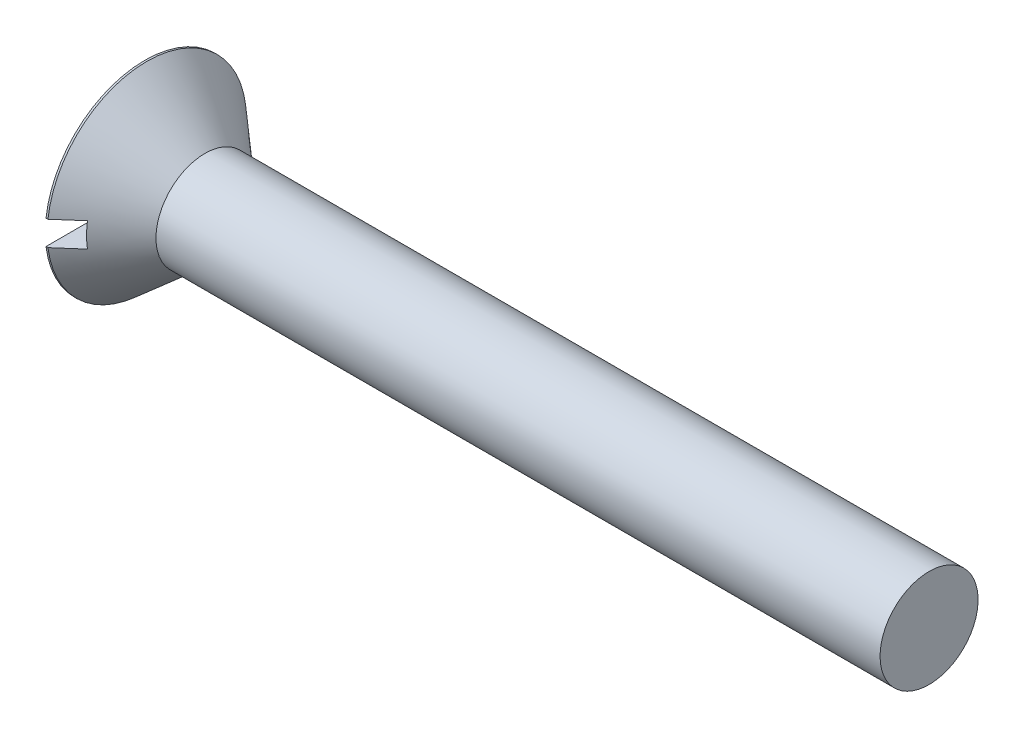
ISO-10303-21;
HEADER;
FILE_DESCRIPTION(('STEP AP214'),'2;1');
FILE_NAME('part.step','',(''),(''),'','','');
FILE_SCHEMA(('AUTOMOTIVE_DESIGN { 1 0 10303 214 1 1 1 1 }'));
ENDSEC;
DATA;
#1=APPLICATION_CONTEXT('core data for automotive mechanical design processes');
#2=APPLICATION_PROTOCOL_DEFINITION('international standard','automotive_design',2000,#1);
#3=PRODUCT_CONTEXT('',#1,'mechanical');
#4=PRODUCT('Part','Part','',(#3));
#5=PRODUCT_RELATED_PRODUCT_CATEGORY('part','',(#4));
#6=PRODUCT_DEFINITION_FORMATION('','',#4);
#7=PRODUCT_DEFINITION_CONTEXT('part definition',#1,'design');
#8=PRODUCT_DEFINITION('design','',#6,#7);
#9=PRODUCT_DEFINITION_SHAPE('','',#8);
#10=(LENGTH_UNIT() NAMED_UNIT(*) SI_UNIT(.MILLI.,.METRE.));
#11=(NAMED_UNIT(*) PLANE_ANGLE_UNIT() SI_UNIT($,.RADIAN.));
#12=(NAMED_UNIT(*) SI_UNIT($,.STERADIAN.) SOLID_ANGLE_UNIT());
#13=UNCERTAINTY_MEASURE_WITH_UNIT(LENGTH_MEASURE(1.E-05),#10,'distance_accuracy_value','');
#14=(GEOMETRIC_REPRESENTATION_CONTEXT(3) GLOBAL_UNCERTAINTY_ASSIGNED_CONTEXT((#13)) GLOBAL_UNIT_ASSIGNED_CONTEXT((#10,
#11,#12)) REPRESENTATION_CONTEXT('',''));
#15=CARTESIAN_POINT('',(0.,0.,0.));
#16=DIRECTION('',(0.,0.,1.));
#17=DIRECTION('',(1.,0.,0.));
#18=AXIS2_PLACEMENT_3D('',#15,#16,#17);
#19=CARTESIAN_POINT('',(0.,0.,0.));
#20=DIRECTION('',(-1.,0.,0.));
#21=DIRECTION('',(0.,0.,1.));
#22=AXIS2_PLACEMENT_3D('',#19,#20,#21);
#23=PLANE('',#22);
#24=DIRECTION('',(0.,0.,-1.));
#25=VECTOR('',#24,1.);
#26=CARTESIAN_POINT('',(0.,1.1938,9.6774));
#27=LINE('',#26,#25);
#28=CARTESIAN_POINT('',(0.,1.1938,9.60348438432634));
#29=VERTEX_POINT('',#28);
#30=CARTESIAN_POINT('',(0.,1.1938,-9.60348438432634));
#31=VERTEX_POINT('',#30);
#32=EDGE_CURVE('E143',#29,#31,#27,.T.);
#33=ORIENTED_EDGE('',*,*,#32,.F.);
#34=CARTESIAN_POINT('',(0.,0.,0.));
#35=DIRECTION('',(-1.,0.,0.));
#36=DIRECTION('',(0.,0.,1.));
#37=AXIS2_PLACEMENT_3D('',#34,#35,#36);
#38=CIRCLE('',#37,9.6774);
#39=EDGE_CURVE('E98',#29,#31,#38,.T.);
#40=ORIENTED_EDGE('',*,*,#39,.T.);
#41=EDGE_LOOP('',(#33,#40));
#42=FACE_BOUND('',#41,.T.);
#43=ADVANCED_FACE('F32',(#42),#23,.T.);
#44=CARTESIAN_POINT('',(-6.34999999999999,0.,0.));
#45=DIRECTION('',(-1.,0.,0.));
#46=DIRECTION('',(0.,0.,1.));
#47=AXIS2_PLACEMENT_3D('',#44,#45,#46);
#48=CYLINDRICAL_SURFACE('',#47,9.6774);
#49=DIRECTION('',(-1.,0.,0.));
#50=VECTOR('',#49,1.);
#51=CARTESIAN_POINT('',(-6.34999999999999,1.1938,-9.60348438432634));
#52=LINE('',#51,#50);
#53=CARTESIAN_POINT('',(0.188054315349483,1.1938,-9.60348438432635));
#54=VERTEX_POINT('',#53);
#55=EDGE_CURVE('E60',#31,#54,#52,.F.);
#56=ORIENTED_EDGE('',*,*,#55,.F.);
#57=ORIENTED_EDGE('',*,*,#39,.F.);
#58=DIRECTION('',(-1.,0.,0.));
#59=VECTOR('',#58,1.);
#60=CARTESIAN_POINT('',(-6.34999999999999,1.1938,9.60348438432634));
#61=LINE('',#60,#59);
#62=CARTESIAN_POINT('',(0.188054315349483,1.1938,9.60348438432635));
#63=VERTEX_POINT('',#62);
#64=EDGE_CURVE('E146',#63,#29,#61,.T.);
#65=ORIENTED_EDGE('',*,*,#64,.F.);
#66=CARTESIAN_POINT('',(0.188054315349483,0.,0.));
#67=DIRECTION('',(-1.,0.,0.));
#68=DIRECTION('',(0.,0.,1.));
#69=AXIS2_PLACEMENT_3D('',#66,#67,#68);
#70=CIRCLE('',#69,9.6774);
#71=EDGE_CURVE('E109',#63,#54,#70,.T.);
#72=ORIENTED_EDGE('',*,*,#71,.T.);
#73=EDGE_LOOP('',(#56,#57,#65,#72));
#74=FACE_BOUND('',#73,.T.);
#75=ADVANCED_FACE('F145',(#74),#48,.T.);
#76=DIRECTION('',(0.,0.,1.));
#77=VECTOR('',#76,1.);
#78=CARTESIAN_POINT('',(0.,-1.1938,-9.6774));
#79=LINE('',#78,#77);
#80=CARTESIAN_POINT('',(0.,-1.1938,-9.60348438432634));
#81=VERTEX_POINT('',#80);
#82=CARTESIAN_POINT('',(0.,-1.1938,9.60348438432634));
#83=VERTEX_POINT('',#82);
#84=EDGE_CURVE('E103',#81,#83,#79,.T.);
#85=ORIENTED_EDGE('',*,*,#84,.F.);
#86=EDGE_CURVE('E128',#81,#83,#38,.T.);
#87=ORIENTED_EDGE('',*,*,#86,.T.);
#88=EDGE_LOOP('',(#85,#87));
#89=FACE_BOUND('',#88,.T.);
#90=ADVANCED_FACE('F34',(#89),#23,.T.);
#91=DIRECTION('',(-1.,0.,0.));
#92=VECTOR('',#91,1.);
#93=CARTESIAN_POINT('',(-6.34999999999999,-1.1938,9.60348438432634));
#94=LINE('',#93,#92);
#95=CARTESIAN_POINT('',(0.188054315349483,-1.1938,9.60348438432635));
#96=VERTEX_POINT('',#95);
#97=EDGE_CURVE('E129',#83,#96,#94,.F.);
#98=ORIENTED_EDGE('',*,*,#97,.F.);
#99=ORIENTED_EDGE('',*,*,#86,.F.);
#100=DIRECTION('',(-1.,0.,0.));
#101=VECTOR('',#100,1.);
#102=CARTESIAN_POINT('',(-6.34999999999999,-1.1938,-9.60348438432634));
#103=LINE('',#102,#101);
#104=CARTESIAN_POINT('',(0.188054315349483,-1.1938,-9.60348438432635));
#105=VERTEX_POINT('',#104);
#106=EDGE_CURVE('E118',#105,#81,#103,.T.);
#107=ORIENTED_EDGE('',*,*,#106,.F.);
#108=EDGE_CURVE('E126',#105,#96,#70,.T.);
#109=ORIENTED_EDGE('',*,*,#108,.T.);
#110=EDGE_LOOP('',(#98,#99,#107,#109));
#111=FACE_BOUND('',#110,.T.);
#112=ADVANCED_FACE('F125',(#111),#48,.T.);
#113=CARTESIAN_POINT('',(0.188054315349483,0.,0.));
#114=DIRECTION('',(-1.,0.,0.));
#115=DIRECTION('',(0.,0.,1.));
#116=AXIS2_PLACEMENT_3D('',#113,#114,#115);
#117=CONICAL_SURFACE('',#116,9.6774,0.715584993317677);
#118=CARTESIAN_POINT('',(-11.4898026353366,1.1938,-19.7928369826092));
#119=CARTESIAN_POINT('',(-10.7282739013221,1.1938,-19.1296381719911));
#120=CARTESIAN_POINT('',(-9.96679664791202,1.1938,-18.4663802073044));
#121=CARTESIAN_POINT('',(-8.44400448853546,1.1938,-17.1396696071036));
#122=CARTESIAN_POINT('',(-7.68268958347168,1.1938,-16.4762169705534));
#123=CARTESIAN_POINT('',(-6.16009107003556,1.1938,-15.1488746382848));
#124=CARTESIAN_POINT('',(-5.39880752170639,1.1938,-14.4849848736861));
#125=CARTESIAN_POINT('',(-3.87658787542096,1.1938,-13.156815015664));
#126=CARTESIAN_POINT('',(-3.11565177568116,1.1938,-12.4925349242851));
#127=CARTESIAN_POINT('',(-1.61266837529184,1.1938,-11.1793728113545));
#128=CARTESIAN_POINT('',(-0.870608031036538,1.1938,-10.5305057197294));
#129=CARTESIAN_POINT('',(0.612654729346588,1.1938,-9.23176820965605));
#130=CARTESIAN_POINT('',(1.35385713234852,1.1938,-8.58189777620339));
#131=CARTESIAN_POINT('',(2.46431349757707,1.1938,-7.6057063127283));
#132=CARTESIAN_POINT('',(2.83420463694768,1.1938,-7.28011039465054));
#133=CARTESIAN_POINT('',(3.5733462958958,1.1938,-6.62818839376527));
#134=CARTESIAN_POINT('',(3.94259681230671,1.1938,-6.30186230736668));
#135=CARTESIAN_POINT('',(4.68009898382822,1.1938,-5.64810195873326));
#136=CARTESIAN_POINT('',(5.04835066622805,1.1938,-5.32066772733487));
#137=CARTESIAN_POINT('',(5.59944958950579,1.1938,-4.828088397102));
#138=CARTESIAN_POINT('',(5.78293538370408,1.1938,-4.66365796437121));
#139=CARTESIAN_POINT('',(6.14932062944482,1.1938,-4.33414540663899));
#140=CARTESIAN_POINT('',(6.33222008249685,1.1938,-4.16906328331783));
#141=CARTESIAN_POINT('',(6.61085838707249,1.1938,-3.91630624190142));
#142=CARTESIAN_POINT('',(6.7068950906178,1.1938,-3.82895981383194));
#143=CARTESIAN_POINT('',(6.89868546128946,1.1938,-3.65395652107032));
#144=CARTESIAN_POINT('',(6.99443912761007,1.1938,-3.56629965549599));
#145=CARTESIAN_POINT('',(7.28123634095181,1.1938,-3.30272759921683));
#146=CARTESIAN_POINT('',(7.47176893215877,1.1938,-3.12625362774134));
#147=CARTESIAN_POINT('',(7.75652836875402,1.1938,-2.85918720679188));
#148=CARTESIAN_POINT('',(7.85158225556605,1.1938,-2.76947695394893));
#149=CARTESIAN_POINT('',(8.04094270173715,1.1938,-2.58927165090814));
#150=CARTESIAN_POINT('',(8.13524926866174,1.1938,-2.49877660867459));
#151=CARTESIAN_POINT('',(8.32280199349844,1.1938,-2.31680042579566));
#152=CARTESIAN_POINT('',(8.41604873368795,1.1938,-2.22531988634259));
#153=CARTESIAN_POINT('',(8.6011346078612,1.1938,-2.04094854239069));
#154=CARTESIAN_POINT('',(8.6929738110529,1.1938,-1.94805780768049));
#155=CARTESIAN_POINT('',(8.87422797190535,1.1938,-1.76066399626998));
#156=CARTESIAN_POINT('',(8.96365125965577,1.1938,-1.66616899895782));
#157=CARTESIAN_POINT('',(9.13952454990479,1.1938,-1.47414431004954));
#158=CARTESIAN_POINT('',(9.22596985906224,1.1938,-1.37661025170417));
#159=CARTESIAN_POINT('',(9.35151816301608,1.1938,-1.22717825186044));
#160=CARTESIAN_POINT('',(9.39260236634853,1.1938,-1.17695004477579));
#161=CARTESIAN_POINT('',(9.47299969614775,1.1938,-1.07510106345905));
#162=CARTESIAN_POINT('',(9.5123131602323,1.1938,-1.02348055771595));
#163=CARTESIAN_POINT('',(9.58844644905848,1.1938,-0.918595747564626));
#164=CARTESIAN_POINT('',(9.62527166053205,1.1938,-0.865335382851739));
#165=CARTESIAN_POINT('',(9.69553557346323,1.1938,-0.756643066731603));
#166=CARTESIAN_POINT('',(9.72897683777324,1.1938,-0.701212803511129));
#167=CARTESIAN_POINT('',(9.78229490989066,1.1938,-0.603634652350031));
#168=CARTESIAN_POINT('',(9.80334267457935,1.1938,-0.562131586710286));
#169=CARTESIAN_POINT('',(9.84217202855095,1.1938,-0.47758953141221));
#170=CARTESIAN_POINT('',(9.85995294441654,1.1938,-0.434550227257595));
#171=CARTESIAN_POINT('',(9.89116809212026,1.1938,-0.347314527152102));
#172=CARTESIAN_POINT('',(9.90463847934805,1.1938,-0.303131307184443));
#173=CARTESIAN_POINT('',(9.92643385134319,1.1938,-0.213513453313853));
#174=CARTESIAN_POINT('',(9.93476333760671,1.1938,-0.16807995071195));
#175=CARTESIAN_POINT('',(9.94391422293017,1.1938,-0.0900477356647803));
#176=CARTESIAN_POINT('',(9.94622642713138,1.1938,-0.057620890433388));
#177=CARTESIAN_POINT('',(9.94780330336011,1.1938,0.00730866444990611));
#178=CARTESIAN_POINT('',(9.94706765854469,1.1938,0.039811381638135));
#179=CARTESIAN_POINT('',(9.94028733688771,1.1938,0.137101431386455));
#180=CARTESIAN_POINT('',(9.92966101559382,1.1938,0.20160008074918));
#181=CARTESIAN_POINT('',(9.89262661505728,1.1938,0.35049459972825));
#182=CARTESIAN_POINT('',(9.86193906369473,1.1938,0.433774450610289));
#183=CARTESIAN_POINT('',(9.80699388473532,1.1938,0.554532522865811));
#184=CARTESIAN_POINT('',(9.78712669328242,1.1938,0.594194052190609));
#185=CARTESIAN_POINT('',(9.74504611916625,1.1938,0.672252055325658));
#186=CARTESIAN_POINT('',(9.72283341846574,1.1938,0.710648892611942));
#187=CARTESIAN_POINT('',(9.65802013239421,1.1938,0.816731429600172));
#188=CARTESIAN_POINT('',(9.61337970085071,1.1938,0.883159086062938));
#189=CARTESIAN_POINT('',(9.52026331206001,1.1938,1.01329132600744));
#190=CARTESIAN_POINT('',(9.47178430864526,1.1938,1.07699368376862));
#191=CARTESIAN_POINT('',(9.37210823949184,1.1938,1.20247328026239));
#192=CARTESIAN_POINT('',(9.32090484748038,1.1938,1.2642454579166));
#193=CARTESIAN_POINT('',(9.21665334057523,1.1938,1.38621561131625));
#194=CARTESIAN_POINT('',(9.16360498874108,1.1938,1.44641338311511));
#195=CARTESIAN_POINT('',(9.0558712202194,1.1938,1.56591847516017));
#196=CARTESIAN_POINT('',(9.00117844412958,1.1938,1.62521913531284));
#197=CARTESIAN_POINT('',(8.89076932576251,1.1938,1.74286468104579));
#198=CARTESIAN_POINT('',(8.83505291155422,1.1938,1.80120949890987));
#199=CARTESIAN_POINT('',(8.72293087735949,1.1938,1.91703874022853));
#200=CARTESIAN_POINT('',(8.66652659646751,1.1938,1.97452446257211));
#201=CARTESIAN_POINT('',(8.55310321239535,1.1938,2.08888148786909));
#202=CARTESIAN_POINT('',(8.49608412845418,1.1938,2.14575280993806));
#203=CARTESIAN_POINT('',(8.32594080040157,1.1938,2.31399298383076));
#204=CARTESIAN_POINT('',(8.21210974043435,1.1938,2.4246466836363));
#205=CARTESIAN_POINT('',(7.98316902601451,1.1938,2.64462506391629));
#206=CARTESIAN_POINT('',(7.86805933025104,1.1938,2.75394970121025));
#207=CARTESIAN_POINT('',(7.63692082251556,1.1938,2.97164536682997));
#208=CARTESIAN_POINT('',(7.52089191915196,1.1938,3.08001629801449));
#209=CARTESIAN_POINT('',(7.2881654688085,1.1938,3.29603831860986));
#210=CARTESIAN_POINT('',(7.17146791737414,1.1938,3.40368940321475));
#211=CARTESIAN_POINT('',(6.8204206104814,1.1938,3.72601676561741));
#212=CARTESIAN_POINT('',(6.58532082273434,1.1938,3.93987573533653));
#213=CARTESIAN_POINT('',(6.11392315985063,1.1938,4.36623728025011));
#214=CARTESIAN_POINT('',(5.87762535629344,1.1938,4.57873993480768));
#215=CARTESIAN_POINT('',(5.40574548920108,1.1938,5.00148246261154));
#216=CARTESIAN_POINT('',(5.17016858782836,1.1938,5.21172810071984));
#217=CARTESIAN_POINT('',(4.69845742605191,1.1938,5.63159996322499));
#218=CARTESIAN_POINT('',(4.46232315719595,1.1938,5.8412261781186));
#219=CARTESIAN_POINT('',(3.75350149685631,1.1938,6.46928311178162));
#220=CARTESIAN_POINT('',(3.28022270774331,1.1938,6.88704616821166));
#221=CARTESIAN_POINT('',(2.21621828719052,1.1938,7.82423394194819));
#222=CARTESIAN_POINT('',(1.62524790719567,1.1938,8.34338046616924));
#223=CARTESIAN_POINT('',(0.442525830117864,1.1938,9.38078521090227));
#224=CARTESIAN_POINT('',(-0.149225868826985,1.1938,9.89904342929061));
#225=CARTESIAN_POINT('',(-1.33330631305607,1.1938,10.9350846526926));
#226=CARTESIAN_POINT('',(-1.92563513333196,1.1938,11.4528675719739));
#227=CARTESIAN_POINT('',(-3.11061605933093,1.1938,12.4880633822659));
#228=CARTESIAN_POINT('',(-3.70326816507868,1.1938,13.0054762732481));
#229=CARTESIAN_POINT('',(-5.49445193685419,1.1938,14.5685909035739));
#230=CARTESIAN_POINT('',(-6.69332378922161,1.1938,15.6139027891056));
#231=CARTESIAN_POINT('',(-8.49189186130723,1.1938,17.1813761403767));
#232=CARTESIAN_POINT('',(-9.09140946247876,1.1938,17.7037426397592));
#233=CARTESIAN_POINT('',(-10.2905401878066,1.1938,18.7483656046404));
#234=CARTESIAN_POINT('',(-10.8901533119325,1.1938,19.2706220701738));
#235=CARTESIAN_POINT('',(-11.4898026353366,1.1938,19.7928369826092));
#236=B_SPLINE_CURVE_WITH_KNOTS('',3,(#118,#119,#120,#121,#122,#123,#124,#125,#126,#127,#128,
#129,#130,#131,#132,#133,#134,#135,#136,#137,#138,#139,#140,#141,#142,#143,#144,#145,#146,#147,
#148,#149,#150,#151,#152,#153,#154,#155,#156,#157,#158,#159,#160,#161,#162,#163,#164,#165,#166,
#167,#168,#169,#170,#171,#172,#173,#174,#175,#176,#177,#178,#179,#180,#181,#182,#183,#184,#185,
#186,#187,#188,#189,#190,#191,#192,#193,#194,#195,#196,#197,#198,#199,#200,#201,#202,#203,#204,
#205,#206,#207,#208,#209,#210,#211,#212,#213,#214,#215,#216,#217,#218,#219,#220,#221,#222,#223,
#224,#225,#226,#227,#228,#229,#230,#231,#232,#233,#234,#235),.UNSPECIFIED.,.F.,.F.,(4,2,2,2,2,2,
2,2,2,2,2,2,2,2,2,2,2,2,2,2,2,2,2,2,2,2,2,2,2,2,2,2,2,2,2,2,2,2,2,2,2,2,2,2,2,2,2,2,2,2,2,2,2,2,
2,2,2,2,4),(0.,3.0294930783553,6.05900258307004,9.08930288302097,12.1195874489531,
15.0768051830438,18.0340675777782,19.512406974151,20.9907536572677,22.4690595351237,
23.2082064359523,23.9473514322697,24.3368016586253,24.7262529926026,25.5053464943481,
25.8974512032567,26.2895519376056,26.6814256802503,27.0732800924151,27.4635432269829,
27.8543956331783,28.0490394420361,28.2436459806837,28.4378167485541,28.6318393417547,
28.7713378867965,28.9108651554193,29.049189416706,29.1873923854761,29.2847831846665,
29.3821841084928,29.5771956093359,29.8418190426298,29.9748586210594,30.1078596238524,
30.3477358586735,30.5878043970473,30.8284570413328,31.0691407065908,31.3111390700322,
31.5531545042363,31.7947567435244,32.0363514441758,32.5125848503851,32.9888336880144,
33.4651304859523,33.9414304606563,34.894870958739,35.8482551463319,36.7955112649444,
37.7427818417582,39.6366290834052,41.9964650492509,44.3563066488178,46.7165126240292,
49.0767187793924,53.8484828133056,56.2339792041329,58.619474838325),.UNSPECIFIED.);
#237=CARTESIAN_POINT('',(2.2352,1.1938,-7.80709754166015));
#238=VERTEX_POINT('',#237);
#239=EDGE_CURVE('E11',#54,#238,#236,.T.);
#240=ORIENTED_EDGE('',*,*,#239,.F.);
#241=ORIENTED_EDGE('',*,*,#71,.F.);
#242=CARTESIAN_POINT('',(2.2352,1.1938,7.80709754166015));
#243=VERTEX_POINT('',#242);
#244=EDGE_CURVE('E36',#243,#63,#236,.T.);
#245=ORIENTED_EDGE('',*,*,#244,.F.);
#246=CARTESIAN_POINT('',(2.2352,0.,0.));
#247=DIRECTION('',(-1.,0.,0.));
#248=DIRECTION('',(0.,0.,1.));
#249=AXIS2_PLACEMENT_3D('',#246,#247,#248);
#250=CIRCLE('',#249,7.89784340595558);
#251=CARTESIAN_POINT('',(2.2352,-1.1938,7.80709754166015));
#252=VERTEX_POINT('',#251);
#253=EDGE_CURVE('E89',#243,#252,#250,.F.);
#254=ORIENTED_EDGE('',*,*,#253,.T.);
#255=CARTESIAN_POINT('',(-11.4898026353366,-1.1938,19.7928369826092));
#256=CARTESIAN_POINT('',(-10.7282739013221,-1.1938,19.1296381719911));
#257=CARTESIAN_POINT('',(-9.96679664791202,-1.1938,18.4663802073045));
#258=CARTESIAN_POINT('',(-8.44400448853547,-1.1938,17.1396696071036));
#259=CARTESIAN_POINT('',(-7.68268958347169,-1.1938,16.4762169705534));
#260=CARTESIAN_POINT('',(-6.16009107003557,-1.1938,15.1488746382848));
#261=CARTESIAN_POINT('',(-5.39880752170641,-1.1938,14.4849848736861));
#262=CARTESIAN_POINT('',(-3.87658787542097,-1.1938,13.156815015664));
#263=CARTESIAN_POINT('',(-3.11565177568118,-1.1938,12.4925349242851));
#264=CARTESIAN_POINT('',(-1.61266837529185,-1.1938,11.1793728113545));
#265=CARTESIAN_POINT('',(-0.870608031036553,-1.1938,10.5305057197294));
#266=CARTESIAN_POINT('',(0.612654729346576,-1.1938,9.23176820965606));
#267=CARTESIAN_POINT('',(1.35385713234851,-1.1938,8.5818977762034));
#268=CARTESIAN_POINT('',(2.46431349757706,-1.1938,7.60570631272831));
#269=CARTESIAN_POINT('',(2.83420463694767,-1.1938,7.28011039465055));
#270=CARTESIAN_POINT('',(3.5733462958958,-1.1938,6.62818839376528));
#271=CARTESIAN_POINT('',(3.9425968123067,-1.1938,6.30186230736669));
#272=CARTESIAN_POINT('',(4.68009898382822,-1.1938,5.64810195873326));
#273=CARTESIAN_POINT('',(5.04835066622804,-1.1938,5.32066772733487));
#274=CARTESIAN_POINT('',(5.59944958950579,-1.1938,4.828088397102));
#275=CARTESIAN_POINT('',(5.78293538370408,-1.1938,4.66365796437121));
#276=CARTESIAN_POINT('',(6.14932062944482,-1.1938,4.33414540663899));
#277=CARTESIAN_POINT('',(6.33222008249685,-1.1938,4.16906328331784));
#278=CARTESIAN_POINT('',(6.61085838707249,-1.1938,3.91630624190142));
#279=CARTESIAN_POINT('',(6.7068950906178,-1.1938,3.82895981383194));
#280=CARTESIAN_POINT('',(6.89868546128946,-1.1938,3.65395652107033));
#281=CARTESIAN_POINT('',(6.99443912761006,-1.1938,3.56629965549599));
#282=CARTESIAN_POINT('',(7.28123634095181,-1.1938,3.30272759921684));
#283=CARTESIAN_POINT('',(7.47176893215877,-1.1938,3.12625362774134));
#284=CARTESIAN_POINT('',(7.75652836875402,-1.1938,2.85918720679188));
#285=CARTESIAN_POINT('',(7.85158225556605,-1.1938,2.76947695394893));
#286=CARTESIAN_POINT('',(8.04094270173715,-1.1938,2.58927165090814));
#287=CARTESIAN_POINT('',(8.13524926866174,-1.1938,2.49877660867459));
#288=CARTESIAN_POINT('',(8.32280199349844,-1.1938,2.31680042579566));
#289=CARTESIAN_POINT('',(8.41604873368795,-1.1938,2.22531988634259));
#290=CARTESIAN_POINT('',(8.6011346078612,-1.1938,2.04094854239069));
#291=CARTESIAN_POINT('',(8.6929738110529,-1.1938,1.94805780768049));
#292=CARTESIAN_POINT('',(8.87422797190534,-1.1938,1.76066399626998));
#293=CARTESIAN_POINT('',(8.96365125965577,-1.1938,1.66616899895783));
#294=CARTESIAN_POINT('',(9.13952454990478,-1.1938,1.47414431004954));
#295=CARTESIAN_POINT('',(9.22596985906224,-1.1938,1.37661025170417));
#296=CARTESIAN_POINT('',(9.35151816301608,-1.1938,1.22717825186044));
#297=CARTESIAN_POINT('',(9.39260236634853,-1.1938,1.17695004477579));
#298=CARTESIAN_POINT('',(9.47299969614775,-1.1938,1.07510106345905));
#299=CARTESIAN_POINT('',(9.5123131602323,-1.1938,1.02348055771595));
#300=CARTESIAN_POINT('',(9.58844644905848,-1.1938,0.918595747564625));
#301=CARTESIAN_POINT('',(9.62527166053205,-1.1938,0.865335382851739));
#302=CARTESIAN_POINT('',(9.69553557346323,-1.1938,0.756643066731603));
#303=CARTESIAN_POINT('',(9.72897683777324,-1.1938,0.701212803511128));
#304=CARTESIAN_POINT('',(9.78229490989066,-1.1938,0.603634652350028));
#305=CARTESIAN_POINT('',(9.80334267457935,-1.1938,0.562131586710281));
#306=CARTESIAN_POINT('',(9.84217202855096,-1.1938,0.477589531412205));
#307=CARTESIAN_POINT('',(9.85995294441654,-1.1938,0.434550227257591));
#308=CARTESIAN_POINT('',(9.89116809212026,-1.1938,0.347314527152098));
#309=CARTESIAN_POINT('',(9.90463847934805,-1.1938,0.303131307184439));
#310=CARTESIAN_POINT('',(9.92643385134319,-1.1938,0.21351345331385));
#311=CARTESIAN_POINT('',(9.93476333760671,-1.1938,0.168079950711948));
#312=CARTESIAN_POINT('',(9.94391422293017,-1.1938,0.0900477356647783));
#313=CARTESIAN_POINT('',(9.94622642713138,-1.1938,0.0576208904333856));
#314=CARTESIAN_POINT('',(9.94780330336011,-1.1938,-0.0073086644499082));
#315=CARTESIAN_POINT('',(9.94706765854469,-1.1938,-0.0398113816381363));
#316=CARTESIAN_POINT('',(9.94028733688771,-1.1938,-0.137101431386456));
#317=CARTESIAN_POINT('',(9.92966101559382,-1.1938,-0.201600080749182));
#318=CARTESIAN_POINT('',(9.89262661505728,-1.1938,-0.350494599728253));
#319=CARTESIAN_POINT('',(9.86193906369472,-1.1938,-0.433774450610293));
#320=CARTESIAN_POINT('',(9.80699388473531,-1.1938,-0.554532522865815));
#321=CARTESIAN_POINT('',(9.78712669328241,-1.1938,-0.594194052190612));
#322=CARTESIAN_POINT('',(9.74504611916624,-1.1938,-0.672252055325662));
#323=CARTESIAN_POINT('',(9.72283341846573,-1.1938,-0.710648892611947));
#324=CARTESIAN_POINT('',(9.65802013239421,-1.1938,-0.816731429600179));
#325=CARTESIAN_POINT('',(9.61337970085071,-1.1938,-0.883159086062946));
#326=CARTESIAN_POINT('',(9.52026331206,-1.1938,-1.01329132600745));
#327=CARTESIAN_POINT('',(9.47178430864525,-1.1938,-1.07699368376863));
#328=CARTESIAN_POINT('',(9.37210823949182,-1.1938,-1.2024732802624));
#329=CARTESIAN_POINT('',(9.32090484748037,-1.1938,-1.26424545791661));
#330=CARTESIAN_POINT('',(9.21665334057522,-1.1938,-1.38621561131626));
#331=CARTESIAN_POINT('',(9.16360498874107,-1.1938,-1.44641338311512));
#332=CARTESIAN_POINT('',(9.05587122021939,-1.1938,-1.56591847516019));
#333=CARTESIAN_POINT('',(9.00117844412956,-1.1938,-1.62521913531285));
#334=CARTESIAN_POINT('',(8.8907693257625,-1.1938,-1.7428646810458));
#335=CARTESIAN_POINT('',(8.83505291155421,-1.1938,-1.80120949890989));
#336=CARTESIAN_POINT('',(8.72293087735948,-1.1938,-1.91703874022855));
#337=CARTESIAN_POINT('',(8.6665265964675,-1.1938,-1.97452446257212));
#338=CARTESIAN_POINT('',(8.55310321239533,-1.1938,-2.08888148786911));
#339=CARTESIAN_POINT('',(8.49608412845417,-1.1938,-2.14575280993808));
#340=CARTESIAN_POINT('',(8.32594080040155,-1.1938,-2.31399298383077));
#341=CARTESIAN_POINT('',(8.21210974043433,-1.1938,-2.42464668363632));
#342=CARTESIAN_POINT('',(7.98316902601449,-1.1938,-2.64462506391631));
#343=CARTESIAN_POINT('',(7.86805933025102,-1.1938,-2.75394970121027));
#344=CARTESIAN_POINT('',(7.63692082251553,-1.1938,-2.97164536682999));
#345=CARTESIAN_POINT('',(7.52089191915194,-1.1938,-3.08001629801452));
#346=CARTESIAN_POINT('',(7.28816546880847,-1.1938,-3.29603831860989));
#347=CARTESIAN_POINT('',(7.17146791737411,-1.1938,-3.40368940321477));
#348=CARTESIAN_POINT('',(6.82042061048136,-1.1938,-3.72601676561745));
#349=CARTESIAN_POINT('',(6.5853208227343,-1.1938,-3.93987573533656));
#350=CARTESIAN_POINT('',(6.11392315985058,-1.1938,-4.36623728025015));
#351=CARTESIAN_POINT('',(5.87762535629339,-1.1938,-4.57873993480773));
#352=CARTESIAN_POINT('',(5.40574548920103,-1.1938,-5.00148246261159));
#353=CARTESIAN_POINT('',(5.17016858782831,-1.1938,-5.21172810071988));
#354=CARTESIAN_POINT('',(4.69845742605185,-1.1938,-5.63159996322504));
#355=CARTESIAN_POINT('',(4.46232315719589,-1.1938,-5.84122617811866));
#356=CARTESIAN_POINT('',(3.75350149685624,-1.1938,-6.46928311178168));
#357=CARTESIAN_POINT('',(3.28022270774324,-1.1938,-6.88704616821173));
#358=CARTESIAN_POINT('',(2.21621828719044,-1.1938,-7.82423394194826));
#359=CARTESIAN_POINT('',(1.62524790719559,-1.1938,-8.34338046616931));
#360=CARTESIAN_POINT('',(0.442525830117799,-1.1938,-9.38078521090233));
#361=CARTESIAN_POINT('',(-0.149225868827044,-1.1938,-9.89904342929067));
#362=CARTESIAN_POINT('',(-1.33330631305612,-1.1938,-10.9350846526926));
#363=CARTESIAN_POINT('',(-1.92563513333201,-1.1938,-11.452867571974));
#364=CARTESIAN_POINT('',(-3.11061605933097,-1.1938,-12.4880633822659));
#365=CARTESIAN_POINT('',(-3.70326816507871,-1.1938,-13.0054762732482));
#366=CARTESIAN_POINT('',(-5.49445193685421,-1.1938,-14.5685909035739));
#367=CARTESIAN_POINT('',(-6.69332378922163,-1.1938,-15.6139027891056));
#368=CARTESIAN_POINT('',(-8.49189186130724,-1.1938,-17.1813761403767));
#369=CARTESIAN_POINT('',(-9.09140946247877,-1.1938,-17.7037426397592));
#370=CARTESIAN_POINT('',(-10.2905401878066,-1.1938,-18.7483656046404));
#371=CARTESIAN_POINT('',(-10.8901533119325,-1.1938,-19.2706220701738));
#372=CARTESIAN_POINT('',(-11.4898026353366,-1.1938,-19.7928369826092));
#373=B_SPLINE_CURVE_WITH_KNOTS('',3,(#255,#256,#257,#258,#259,#260,#261,#262,#263,#264,#265,
#266,#267,#268,#269,#270,#271,#272,#273,#274,#275,#276,#277,#278,#279,#280,#281,#282,#283,#284,
#285,#286,#287,#288,#289,#290,#291,#292,#293,#294,#295,#296,#297,#298,#299,#300,#301,#302,#303,
#304,#305,#306,#307,#308,#309,#310,#311,#312,#313,#314,#315,#316,#317,#318,#319,#320,#321,#322,
#323,#324,#325,#326,#327,#328,#329,#330,#331,#332,#333,#334,#335,#336,#337,#338,#339,#340,#341,
#342,#343,#344,#345,#346,#347,#348,#349,#350,#351,#352,#353,#354,#355,#356,#357,#358,#359,#360,
#361,#362,#363,#364,#365,#366,#367,#368,#369,#370,#371,#372),.UNSPECIFIED.,.F.,.F.,(4,2,2,2,2,2,
2,2,2,2,2,2,2,2,2,2,2,2,2,2,2,2,2,2,2,2,2,2,2,2,2,2,2,2,2,2,2,2,2,2,2,2,2,2,2,2,2,2,2,2,2,2,2,2,
2,2,2,2,4),(0.,3.02949307835529,6.05900258307003,9.08930288302095,12.1195874489531,
15.0768051830438,18.0340675777782,19.512406974151,20.9907536572677,22.4690595351237,
23.2082064359523,23.9473514322697,24.3368016586253,24.7262529926026,25.5053464943481,
25.8974512032567,26.2895519376056,26.6814256802503,27.0732800924152,27.4635432269829,
27.8543956331783,28.0490394420361,28.2436459806837,28.4378167485541,28.6318393417547,
28.7713378867965,28.9108651554193,29.049189416706,29.1873923854761,29.2847831846665,
29.3821841084928,29.5771956093359,29.8418190426298,29.9748586210594,30.1078596238524,
30.3477358586735,30.5878043970473,30.8284570413328,31.0691407065908,31.3111390700322,
31.5531545042363,31.7947567435244,32.0363514441758,32.5125848503851,32.9888336880144,
33.4651304859523,33.9414304606563,34.8948709587391,35.848255146332,36.7955112649445,
37.7427818417583,39.6366290834053,41.996465049251,44.3563066488179,46.7165126240293,
49.0767187793924,53.8484828133056,56.2339792041329,58.619474838325),.UNSPECIFIED.);
#374=EDGE_CURVE('E97',#96,#252,#373,.T.);
#375=ORIENTED_EDGE('',*,*,#374,.F.);
#376=ORIENTED_EDGE('',*,*,#108,.F.);
#377=CARTESIAN_POINT('',(2.2352,-1.1938,-7.80709754166015));
#378=VERTEX_POINT('',#377);
#379=EDGE_CURVE('E46',#378,#105,#373,.T.);
#380=ORIENTED_EDGE('',*,*,#379,.F.);
#381=EDGE_CURVE('E100',#378,#238,#250,.F.);
#382=ORIENTED_EDGE('',*,*,#381,.T.);
#383=EDGE_LOOP('',(#240,#241,#245,#254,#375,#376,#380,#382));
#384=FACE_BOUND('',#383,.T.);
#385=CARTESIAN_POINT('',(5.842,0.,0.));
#386=DIRECTION('',(-1.,0.,0.));
#387=DIRECTION('',(0.,0.,1.));
#388=AXIS2_PLACEMENT_3D('',#385,#386,#387);
#389=CIRCLE('',#388,4.7625);
#390=CARTESIAN_POINT('',(5.842,0.,4.7625));
#391=VERTEX_POINT('',#390);
#392=EDGE_CURVE('E131',#391,#391,#389,.T.);
#393=ORIENTED_EDGE('',*,*,#392,.T.);
#394=EDGE_LOOP('',(#393));
#395=FACE_BOUND('',#394,.T.);
#396=ADVANCED_FACE('F106',(#384,#395),#117,.T.);
#397=CARTESIAN_POINT('',(-6.34999999999999,0.,0.));
#398=DIRECTION('',(-1.,0.,0.));
#399=DIRECTION('',(0.,0.,1.));
#400=AXIS2_PLACEMENT_3D('',#397,#398,#399);
#401=CYLINDRICAL_SURFACE('',#400,4.7625);
#402=CARTESIAN_POINT('',(76.2,0.,0.));
#403=DIRECTION('',(-1.,0.,0.));
#404=DIRECTION('',(0.,0.,1.));
#405=AXIS2_PLACEMENT_3D('',#402,#403,#404);
#406=CIRCLE('',#405,4.7625);
#407=CARTESIAN_POINT('',(76.2,0.,4.7625));
#408=VERTEX_POINT('',#407);
#409=EDGE_CURVE('E134',#408,#408,#406,.T.);
#410=ORIENTED_EDGE('',*,*,#409,.T.);
#411=EDGE_LOOP('',(#410));
#412=FACE_BOUND('',#411,.T.);
#413=ORIENTED_EDGE('',*,*,#392,.F.);
#414=EDGE_LOOP('',(#413));
#415=FACE_BOUND('',#414,.T.);
#416=ADVANCED_FACE('F187',(#412,#415),#401,.T.);
#417=CARTESIAN_POINT('',(76.2,4.7625,0.));
#418=DIRECTION('',(1.,0.,0.));
#419=DIRECTION('',(0.,0.,-1.));
#420=AXIS2_PLACEMENT_3D('',#417,#418,#419);
#421=PLANE('',#420);
#422=ORIENTED_EDGE('',*,*,#409,.F.);
#423=EDGE_LOOP('',(#422));
#424=FACE_BOUND('',#423,.T.);
#425=ADVANCED_FACE('F197',(#424),#421,.T.);
#426=CARTESIAN_POINT('',(2.2352,1.1938,9.6774));
#427=DIRECTION('',(0.,1.,0.));
#428=DIRECTION('',(0.,0.,1.));
#429=AXIS2_PLACEMENT_3D('',#426,#427,#428);
#430=PLANE('',#429);
#431=ORIENTED_EDGE('',*,*,#55,.T.);
#432=ORIENTED_EDGE('',*,*,#239,.T.);
#433=DIRECTION('',(0.,0.,-1.));
#434=VECTOR('',#433,1.);
#435=CARTESIAN_POINT('',(2.2352,1.1938,9.6774));
#436=LINE('',#435,#434);
#437=EDGE_CURVE('E92',#243,#238,#436,.T.);
#438=ORIENTED_EDGE('',*,*,#437,.F.);
#439=ORIENTED_EDGE('',*,*,#244,.T.);
#440=ORIENTED_EDGE('',*,*,#64,.T.);
#441=ORIENTED_EDGE('',*,*,#32,.T.);
#442=EDGE_LOOP('',(#431,#432,#438,#439,#440,#441));
#443=FACE_BOUND('',#442,.T.);
#444=ADVANCED_FACE('F101',(#443),#430,.F.);
#445=CARTESIAN_POINT('',(2.2352,-1.1938,-9.6774));
#446=DIRECTION('',(0.,-1.,0.));
#447=DIRECTION('',(0.,0.,-1.));
#448=AXIS2_PLACEMENT_3D('',#445,#446,#447);
#449=PLANE('',#448);
#450=ORIENTED_EDGE('',*,*,#97,.T.);
#451=ORIENTED_EDGE('',*,*,#374,.T.);
#452=DIRECTION('',(0.,0.,1.));
#453=VECTOR('',#452,1.);
#454=CARTESIAN_POINT('',(2.2352,-1.1938,-9.6774));
#455=LINE('',#454,#453);
#456=EDGE_CURVE('E53',#378,#252,#455,.T.);
#457=ORIENTED_EDGE('',*,*,#456,.F.);
#458=ORIENTED_EDGE('',*,*,#379,.T.);
#459=ORIENTED_EDGE('',*,*,#106,.T.);
#460=ORIENTED_EDGE('',*,*,#84,.T.);
#461=EDGE_LOOP('',(#450,#451,#457,#458,#459,#460));
#462=FACE_BOUND('',#461,.T.);
#463=ADVANCED_FACE('F117',(#462),#449,.F.);
#464=CARTESIAN_POINT('',(2.2352,1.1938,-9.67739999999999));
#465=DIRECTION('',(-1.,0.,0.));
#466=DIRECTION('',(0.,0.,1.));
#467=AXIS2_PLACEMENT_3D('',#464,#465,#466);
#468=PLANE('',#467);
#469=ORIENTED_EDGE('',*,*,#456,.T.);
#470=ORIENTED_EDGE('',*,*,#253,.F.);
#471=ORIENTED_EDGE('',*,*,#437,.T.);
#472=ORIENTED_EDGE('',*,*,#381,.F.);
#473=EDGE_LOOP('',(#469,#470,#471,#472));
#474=FACE_BOUND('',#473,.T.);
#475=ADVANCED_FACE('F91',(#474),#468,.T.);
#476=CLOSED_SHELL('',(#43,#75,#90,#112,#396,#416,#425,#444,#463,#475));
#477=MANIFOLD_SOLID_BREP('B2',#476);
#478=ADVANCED_BREP_SHAPE_REPRESENTATION('',(#18,#477),#14);
#479=SHAPE_DEFINITION_REPRESENTATION(#9,#478);
ENDSEC;
END-ISO-10303-21;
